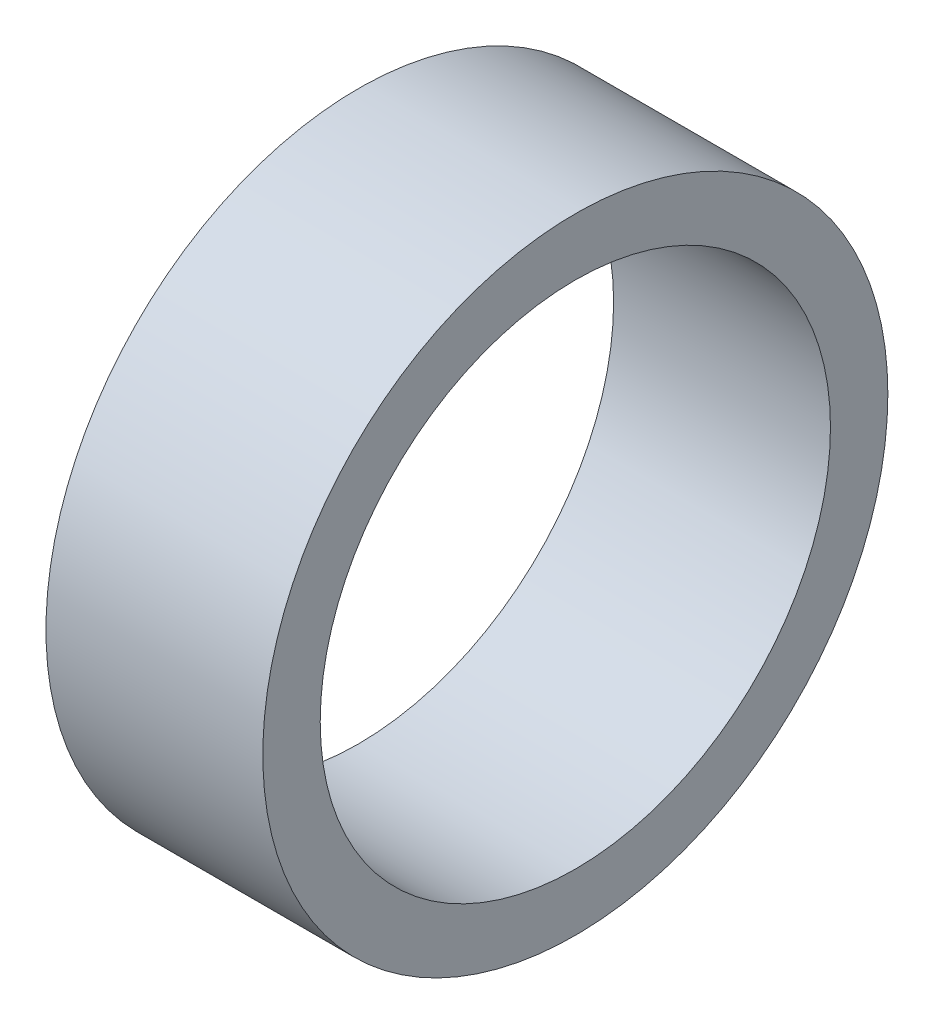
ISO-10303-21;
HEADER;
FILE_DESCRIPTION(('STEP AP214'),'2;1');
FILE_NAME('part.step','',(''),(''),'','','');
FILE_SCHEMA(('AUTOMOTIVE_DESIGN { 1 0 10303 214 1 1 1 1 }'));
ENDSEC;
DATA;
#1=APPLICATION_CONTEXT('core data for automotive mechanical design processes');
#2=APPLICATION_PROTOCOL_DEFINITION('international standard','automotive_design',2000,#1);
#3=PRODUCT_CONTEXT('',#1,'mechanical');
#4=PRODUCT('Part','Part','',(#3));
#5=PRODUCT_RELATED_PRODUCT_CATEGORY('part','',(#4));
#6=PRODUCT_DEFINITION_FORMATION('','',#4);
#7=PRODUCT_DEFINITION_CONTEXT('part definition',#1,'design');
#8=PRODUCT_DEFINITION('design','',#6,#7);
#9=PRODUCT_DEFINITION_SHAPE('','',#8);
#10=(LENGTH_UNIT() NAMED_UNIT(*) SI_UNIT(.MILLI.,.METRE.));
#11=(NAMED_UNIT(*) PLANE_ANGLE_UNIT() SI_UNIT($,.RADIAN.));
#12=(NAMED_UNIT(*) SI_UNIT($,.STERADIAN.) SOLID_ANGLE_UNIT());
#13=UNCERTAINTY_MEASURE_WITH_UNIT(LENGTH_MEASURE(1.E-05),#10,'distance_accuracy_value','');
#14=(GEOMETRIC_REPRESENTATION_CONTEXT(3) GLOBAL_UNCERTAINTY_ASSIGNED_CONTEXT((#13)) GLOBAL_UNIT_ASSIGNED_CONTEXT((#10,
#11,#12)) REPRESENTATION_CONTEXT('',''));
#15=CARTESIAN_POINT('',(0.,0.,0.));
#16=DIRECTION('',(0.,0.,1.));
#17=DIRECTION('',(1.,0.,0.));
#18=AXIS2_PLACEMENT_3D('',#15,#16,#17);
#19=CARTESIAN_POINT('',(8.5,0.,0.));
#20=DIRECTION('',(1.,0.,0.));
#21=DIRECTION('',(0.,0.,-1.));
#22=AXIS2_PLACEMENT_3D('',#19,#20,#21);
#23=PLANE('',#22);
#24=CARTESIAN_POINT('',(8.5,0.,0.));
#25=DIRECTION('',(1.,0.,0.));
#26=DIRECTION('',(0.,0.,-1.));
#27=AXIS2_PLACEMENT_3D('',#24,#25,#26);
#28=CIRCLE('',#27,12.25);
#29=CARTESIAN_POINT('',(8.5,0.,-12.25));
#30=VERTEX_POINT('',#29);
#31=EDGE_CURVE('E11',#30,#30,#28,.T.);
#32=ORIENTED_EDGE('',*,*,#31,.T.);
#33=EDGE_LOOP('',(#32));
#34=FACE_BOUND('',#33,.T.);
#35=CARTESIAN_POINT('',(8.5,0.,0.));
#36=DIRECTION('',(1.,0.,0.));
#37=DIRECTION('',(0.,0.,-1.));
#38=AXIS2_PLACEMENT_3D('',#35,#36,#37);
#39=CIRCLE('',#38,10.);
#40=CARTESIAN_POINT('',(8.5,0.,-10.));
#41=VERTEX_POINT('',#40);
#42=EDGE_CURVE('E57',#41,#41,#39,.T.);
#43=ORIENTED_EDGE('',*,*,#42,.F.);
#44=EDGE_LOOP('',(#43));
#45=FACE_BOUND('',#44,.T.);
#46=ADVANCED_FACE('F44',(#34,#45),#23,.T.);
#47=CARTESIAN_POINT('',(0.,0.,0.));
#48=DIRECTION('',(1.,0.,0.));
#49=DIRECTION('',(0.,0.,-1.));
#50=AXIS2_PLACEMENT_3D('',#47,#48,#49);
#51=PLANE('',#50);
#52=CARTESIAN_POINT('',(0.,0.,0.));
#53=DIRECTION('',(1.,0.,0.));
#54=DIRECTION('',(0.,0.,-1.));
#55=AXIS2_PLACEMENT_3D('',#52,#53,#54);
#56=CIRCLE('',#55,12.25);
#57=CARTESIAN_POINT('',(0.,0.,-12.25));
#58=VERTEX_POINT('',#57);
#59=EDGE_CURVE('E47',#58,#58,#56,.T.);
#60=ORIENTED_EDGE('',*,*,#59,.F.);
#61=EDGE_LOOP('',(#60));
#62=FACE_BOUND('',#61,.T.);
#63=CARTESIAN_POINT('',(0.,0.,0.));
#64=DIRECTION('',(1.,0.,0.));
#65=DIRECTION('',(0.,0.,-1.));
#66=AXIS2_PLACEMENT_3D('',#63,#64,#65);
#67=CIRCLE('',#66,10.);
#68=CARTESIAN_POINT('',(0.,0.,-10.));
#69=VERTEX_POINT('',#68);
#70=EDGE_CURVE('E59',#69,#69,#67,.T.);
#71=ORIENTED_EDGE('',*,*,#70,.T.);
#72=EDGE_LOOP('',(#71));
#73=FACE_BOUND('',#72,.T.);
#74=ADVANCED_FACE('F66',(#62,#73),#51,.F.);
#75=CARTESIAN_POINT('',(8.5,0.,0.));
#76=DIRECTION('',(-1.,0.,0.));
#77=DIRECTION('',(0.,0.,1.));
#78=AXIS2_PLACEMENT_3D('',#75,#76,#77);
#79=CYLINDRICAL_SURFACE('',#78,12.25);
#80=ORIENTED_EDGE('',*,*,#31,.F.);
#81=EDGE_LOOP('',(#80));
#82=FACE_BOUND('',#81,.T.);
#83=ORIENTED_EDGE('',*,*,#59,.T.);
#84=EDGE_LOOP('',(#83));
#85=FACE_BOUND('',#84,.T.);
#86=ADVANCED_FACE('F50',(#82,#85),#79,.T.);
#87=CARTESIAN_POINT('',(8.5,0.,0.));
#88=DIRECTION('',(-1.,0.,0.));
#89=DIRECTION('',(0.,0.,1.));
#90=AXIS2_PLACEMENT_3D('',#87,#88,#89);
#91=CYLINDRICAL_SURFACE('',#90,10.);
#92=ORIENTED_EDGE('',*,*,#42,.T.);
#93=EDGE_LOOP('',(#92));
#94=FACE_BOUND('',#93,.T.);
#95=ORIENTED_EDGE('',*,*,#70,.F.);
#96=EDGE_LOOP('',(#95));
#97=FACE_BOUND('',#96,.T.);
#98=ADVANCED_FACE('F63',(#94,#97),#91,.F.);
#99=CLOSED_SHELL('',(#46,#74,#86,#98));
#100=MANIFOLD_SOLID_BREP('B2',#99);
#101=ADVANCED_BREP_SHAPE_REPRESENTATION('',(#18,#100),#14);
#102=SHAPE_DEFINITION_REPRESENTATION(#9,#101);
ENDSEC;
END-ISO-10303-21;
